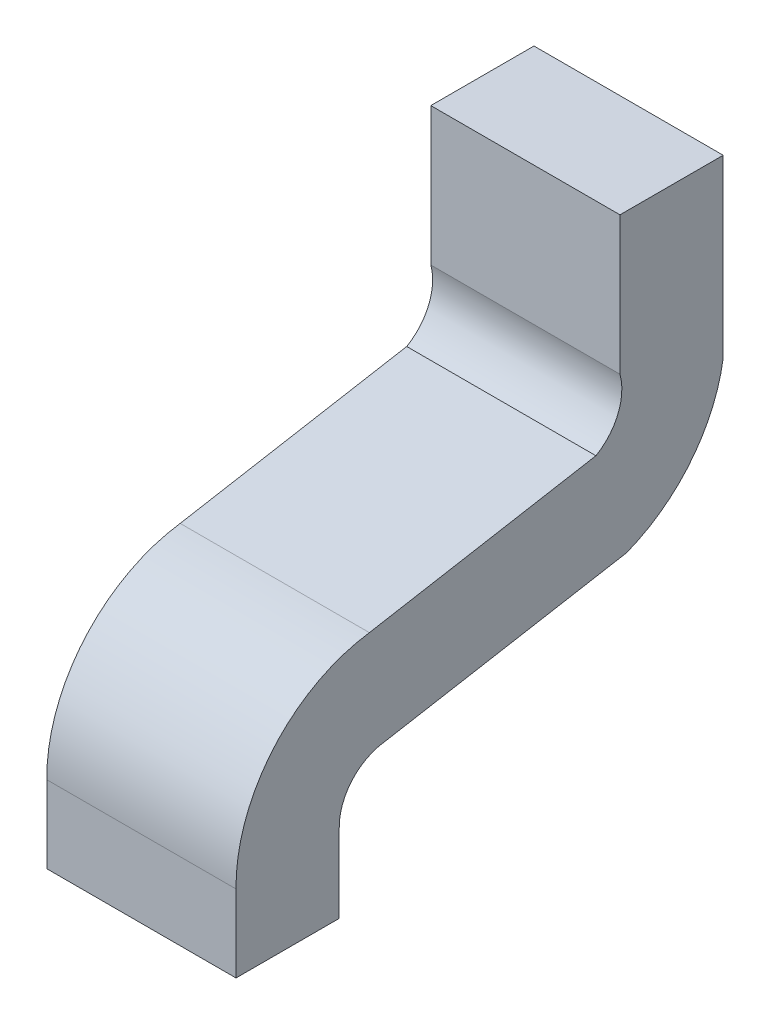
ISO-10303-21;
HEADER;
FILE_DESCRIPTION(('STEP AP214'),'2;1');
FILE_NAME('part.step','',(''),(''),'','','');
FILE_SCHEMA(('AUTOMOTIVE_DESIGN { 1 0 10303 214 1 1 1 1 }'));
ENDSEC;
DATA;
#1=APPLICATION_CONTEXT('core data for automotive mechanical design processes');
#2=APPLICATION_PROTOCOL_DEFINITION('international standard','automotive_design',2000,#1);
#3=PRODUCT_CONTEXT('',#1,'mechanical');
#4=PRODUCT('Part','Part','',(#3));
#5=PRODUCT_RELATED_PRODUCT_CATEGORY('part','',(#4));
#6=PRODUCT_DEFINITION_FORMATION('','',#4);
#7=PRODUCT_DEFINITION_CONTEXT('part definition',#1,'design');
#8=PRODUCT_DEFINITION('design','',#6,#7);
#9=PRODUCT_DEFINITION_SHAPE('','',#8);
#10=(LENGTH_UNIT() NAMED_UNIT(*) SI_UNIT(.MILLI.,.METRE.));
#11=(NAMED_UNIT(*) PLANE_ANGLE_UNIT() SI_UNIT($,.RADIAN.));
#12=(NAMED_UNIT(*) SI_UNIT($,.STERADIAN.) SOLID_ANGLE_UNIT());
#13=UNCERTAINTY_MEASURE_WITH_UNIT(LENGTH_MEASURE(1.E-05),#10,'distance_accuracy_value','');
#14=(GEOMETRIC_REPRESENTATION_CONTEXT(3) GLOBAL_UNCERTAINTY_ASSIGNED_CONTEXT((#13)) GLOBAL_UNIT_ASSIGNED_CONTEXT((#10,
#11,#12)) REPRESENTATION_CONTEXT('',''));
#15=CARTESIAN_POINT('',(0.,0.,0.));
#16=DIRECTION('',(0.,0.,1.));
#17=DIRECTION('',(1.,0.,0.));
#18=AXIS2_PLACEMENT_3D('',#15,#16,#17);
#19=CARTESIAN_POINT('',(0.22,0.566981111233,-0.255632636838));
#20=DIRECTION('',(1.,0.,0.));
#21=DIRECTION('',(0.,-1.,0.));
#22=AXIS2_PLACEMENT_3D('',#19,#20,#21);
#23=PLANE('',#22);
#24=DIRECTION('',(0.,0.,-1.));
#25=VECTOR('',#24,1.);
#26=CARTESIAN_POINT('',(0.22,0.307386061785,0.04787499999997));
#27=LINE('',#26,#25);
#28=CARTESIAN_POINT('',(0.22,0.307386061785,0.04787499999998));
#29=VERTEX_POINT('',#28);
#30=CARTESIAN_POINT('',(0.22,0.307386061785,-0.07212500000003));
#31=VERTEX_POINT('',#30);
#32=EDGE_CURVE('E158',#29,#31,#27,.T.);
#33=ORIENTED_EDGE('',*,*,#32,.T.);
#34=DIRECTION('',(0.,1.,0.));
#35=VECTOR('',#34,1.);
#36=CARTESIAN_POINT('',(0.22,0.307386061785,-0.07212500000003));
#37=LINE('',#36,#35);
#38=CARTESIAN_POINT('',(0.22,0.398034,-0.07212500000003));
#39=VERTEX_POINT('',#38);
#40=EDGE_CURVE('E11',#31,#39,#37,.T.);
#41=ORIENTED_EDGE('',*,*,#40,.T.);
#42=CARTESIAN_POINT('',(0.22,0.399385348479,-0.132109780214));
#43=DIRECTION('',(1.,0.,0.));
#44=DIRECTION('',(0.,1.,0.));
#45=AXIS2_PLACEMENT_3D('',#42,#43,#44);
#46=CIRCLE('',#45,0.06);
#47=CARTESIAN_POINT('',(0.22,0.459004806819,-0.125362915222));
#48=VERTEX_POINT('',#47);
#49=EDGE_CURVE('E261',#48,#39,#46,.T.);
#50=ORIENTED_EDGE('',*,*,#49,.F.);
#51=DIRECTION('',(0.,0.173648177667033,-0.98480775301219));
#52=VECTOR('',#51,1.);
#53=CARTESIAN_POINT('',(0.22,0.459004806819,-0.125362915222));
#54=LINE('',#53,#52);
#55=CARTESIAN_POINT('',(0.22,0.508567174855,-0.406445072001));
#56=VERTEX_POINT('',#55);
#57=EDGE_CURVE('E258',#48,#56,#54,.T.);
#58=ORIENTED_EDGE('',*,*,#57,.T.);
#59=CARTESIAN_POINT('',(0.22,0.676168403342,-0.340795790133));
#60=DIRECTION('',(1.,0.,0.));
#61=DIRECTION('',(0.,1.,0.));
#62=AXIS2_PLACEMENT_3D('',#59,#60,#61);
#63=CIRCLE('',#62,0.18);
#64=CARTESIAN_POINT('',(0.22,0.648175256066,-0.51860575528));
#65=VERTEX_POINT('',#64);
#66=EDGE_CURVE('E167',#56,#65,#63,.T.);
#67=ORIENTED_EDGE('',*,*,#66,.T.);
#68=DIRECTION('',(0.,-1.,0.));
#69=VECTOR('',#68,1.);
#70=CARTESIAN_POINT('',(0.22,0.852705061636,-0.51860575528));
#71=LINE('',#70,#69);
#72=CARTESIAN_POINT('',(0.22,0.852705061636,-0.51860575528));
#73=VERTEX_POINT('',#72);
#74=EDGE_CURVE('E199',#73,#65,#71,.T.);
#75=ORIENTED_EDGE('',*,*,#74,.F.);
#76=DIRECTION('',(0.,0.,-1.));
#77=VECTOR('',#76,1.);
#78=CARTESIAN_POINT('',(0.22,0.852705061636,-0.39860575528));
#79=LINE('',#78,#77);
#80=CARTESIAN_POINT('',(0.22,0.852705061636,-0.39860575528));
#81=VERTEX_POINT('',#80);
#82=EDGE_CURVE('E228',#81,#73,#79,.T.);
#83=ORIENTED_EDGE('',*,*,#82,.F.);
#84=DIRECTION('',(0.,1.,0.));
#85=VECTOR('',#84,1.);
#86=CARTESIAN_POINT('',(0.22,0.692231028585,-0.39860575528));
#87=LINE('',#86,#85);
#88=CARTESIAN_POINT('',(0.22,0.692231028585,-0.39860575528));
#89=VERTEX_POINT('',#88);
#90=EDGE_CURVE('E185',#89,#81,#87,.T.);
#91=ORIENTED_EDGE('',*,*,#90,.F.);
#92=CARTESIAN_POINT('',(0.22,0.676168403342,-0.340795790133));
#93=DIRECTION('',(1.,0.,0.));
#94=DIRECTION('',(0.,1.,0.));
#95=AXIS2_PLACEMENT_3D('',#92,#93,#94);
#96=CIRCLE('',#95,0.06);
#97=CARTESIAN_POINT('',(0.22,0.62409951054,-0.370609048967));
#98=VERTEX_POINT('',#97);
#99=EDGE_CURVE('E194',#98,#89,#96,.T.);
#100=ORIENTED_EDGE('',*,*,#99,.F.);
#101=DIRECTION('',(0.,0.173648177667033,-0.98480775301219));
#102=VECTOR('',#101,1.);
#103=CARTESIAN_POINT('',(0.22,0.577653507815,-0.107200678123));
#104=LINE('',#103,#102);
#105=CARTESIAN_POINT('',(0.22,0.577653507815,-0.107200678123));
#106=VERTEX_POINT('',#105);
#107=EDGE_CURVE('E198',#106,#98,#104,.T.);
#108=ORIENTED_EDGE('',*,*,#107,.F.);
#109=CARTESIAN_POINT('',(0.22,0.399385348479,-0.132109780214));
#110=DIRECTION('',(1.,0.,0.));
#111=DIRECTION('',(0.,1.,0.));
#112=AXIS2_PLACEMENT_3D('',#109,#110,#111);
#113=CIRCLE('',#112,0.18);
#114=CARTESIAN_POINT('',(0.22,0.39704464529,0.04787499999998));
#115=VERTEX_POINT('',#114);
#116=EDGE_CURVE('E189',#106,#115,#113,.T.);
#117=ORIENTED_EDGE('',*,*,#116,.T.);
#118=DIRECTION('',(0.,1.,0.));
#119=VECTOR('',#118,1.);
#120=CARTESIAN_POINT('',(0.22,0.307386061785,0.04787499999997));
#121=LINE('',#120,#119);
#122=EDGE_CURVE('E172',#29,#115,#121,.T.);
#123=ORIENTED_EDGE('',*,*,#122,.F.);
#124=EDGE_LOOP('',(#33,#41,#50,#58,#67,#75,#83,#91,#100,#108,#117,#123));
#125=FACE_BOUND('',#124,.T.);
#126=ADVANCED_FACE('F17',(#125),#23,.T.);
#127=CARTESIAN_POINT('',(0.,0.566981111233,-0.255632636838));
#128=DIRECTION('',(1.,0.,0.));
#129=DIRECTION('',(0.,-1.,0.));
#130=AXIS2_PLACEMENT_3D('',#127,#128,#129);
#131=PLANE('',#130);
#132=DIRECTION('',(0.,0.,-1.));
#133=VECTOR('',#132,1.);
#134=CARTESIAN_POINT('',(0.,0.307386061785,0.04787499999997));
#135=LINE('',#134,#133);
#136=CARTESIAN_POINT('',(0.,0.307386061785,0.04787499999998));
#137=VERTEX_POINT('',#136);
#138=CARTESIAN_POINT('',(0.,0.307386061785,-0.07212500000003));
#139=VERTEX_POINT('',#138);
#140=EDGE_CURVE('E150',#137,#139,#135,.T.);
#141=ORIENTED_EDGE('',*,*,#140,.F.);
#142=DIRECTION('',(0.,1.,0.));
#143=VECTOR('',#142,1.);
#144=CARTESIAN_POINT('',(0.,0.307386061785,0.04787499999997));
#145=LINE('',#144,#143);
#146=CARTESIAN_POINT('',(0.,0.39704464529,0.04787499999998));
#147=VERTEX_POINT('',#146);
#148=EDGE_CURVE('E136',#137,#147,#145,.T.);
#149=ORIENTED_EDGE('',*,*,#148,.T.);
#150=CARTESIAN_POINT('',(0.,0.399385348479,-0.132109780214));
#151=DIRECTION('',(1.,0.,0.));
#152=DIRECTION('',(0.,1.,0.));
#153=AXIS2_PLACEMENT_3D('',#150,#151,#152);
#154=CIRCLE('',#153,0.18);
#155=CARTESIAN_POINT('',(0.,0.577653507815,-0.107200678123));
#156=VERTEX_POINT('',#155);
#157=EDGE_CURVE('E179',#156,#147,#154,.T.);
#158=ORIENTED_EDGE('',*,*,#157,.F.);
#159=DIRECTION('',(0.,0.173648177667033,-0.98480775301219));
#160=VECTOR('',#159,1.);
#161=CARTESIAN_POINT('',(0.,0.577653507815,-0.107200678123));
#162=LINE('',#161,#160);
#163=CARTESIAN_POINT('',(0.,0.62409951054,-0.370609048967));
#164=VERTEX_POINT('',#163);
#165=EDGE_CURVE('E190',#156,#164,#162,.T.);
#166=ORIENTED_EDGE('',*,*,#165,.T.);
#167=CARTESIAN_POINT('',(0.,0.676168403342,-0.340795790133));
#168=DIRECTION('',(1.,0.,0.));
#169=DIRECTION('',(0.,1.,0.));
#170=AXIS2_PLACEMENT_3D('',#167,#168,#169);
#171=CIRCLE('',#170,0.06);
#172=CARTESIAN_POINT('',(0.,0.692231028585,-0.39860575528));
#173=VERTEX_POINT('',#172);
#174=EDGE_CURVE('E181',#164,#173,#171,.T.);
#175=ORIENTED_EDGE('',*,*,#174,.T.);
#176=DIRECTION('',(0.,1.,0.));
#177=VECTOR('',#176,1.);
#178=CARTESIAN_POINT('',(0.,0.692231028585,-0.39860575528));
#179=LINE('',#178,#177);
#180=CARTESIAN_POINT('',(0.,0.852705061636,-0.39860575528));
#181=VERTEX_POINT('',#180);
#182=EDGE_CURVE('E224',#173,#181,#179,.T.);
#183=ORIENTED_EDGE('',*,*,#182,.T.);
#184=DIRECTION('',(0.,0.,-1.));
#185=VECTOR('',#184,1.);
#186=CARTESIAN_POINT('',(0.,0.852705061636,-0.39860575528));
#187=LINE('',#186,#185);
#188=CARTESIAN_POINT('',(0.,0.852705061636,-0.51860575528));
#189=VERTEX_POINT('',#188);
#190=EDGE_CURVE('E204',#181,#189,#187,.T.);
#191=ORIENTED_EDGE('',*,*,#190,.T.);
#192=DIRECTION('',(0.,-1.,0.));
#193=VECTOR('',#192,1.);
#194=CARTESIAN_POINT('',(0.,0.852705061636,-0.51860575528));
#195=LINE('',#194,#193);
#196=CARTESIAN_POINT('',(0.,0.648175256066,-0.51860575528));
#197=VERTEX_POINT('',#196);
#198=EDGE_CURVE('E242',#189,#197,#195,.T.);
#199=ORIENTED_EDGE('',*,*,#198,.T.);
#200=CARTESIAN_POINT('',(0.,0.676168403342,-0.340795790133));
#201=DIRECTION('',(1.,0.,0.));
#202=DIRECTION('',(0.,1.,0.));
#203=AXIS2_PLACEMENT_3D('',#200,#201,#202);
#204=CIRCLE('',#203,0.18);
#205=CARTESIAN_POINT('',(0.,0.508567174855,-0.406445072001));
#206=VERTEX_POINT('',#205);
#207=EDGE_CURVE('E166',#206,#197,#204,.T.);
#208=ORIENTED_EDGE('',*,*,#207,.F.);
#209=DIRECTION('',(0.,0.173648177667033,-0.98480775301219));
#210=VECTOR('',#209,1.);
#211=CARTESIAN_POINT('',(0.,0.459004806819,-0.125362915222));
#212=LINE('',#211,#210);
#213=CARTESIAN_POINT('',(0.,0.459004806819,-0.125362915222));
#214=VERTEX_POINT('',#213);
#215=EDGE_CURVE('E255',#214,#206,#212,.T.);
#216=ORIENTED_EDGE('',*,*,#215,.F.);
#217=CARTESIAN_POINT('',(0.,0.399385348479,-0.132109780214));
#218=DIRECTION('',(1.,0.,0.));
#219=DIRECTION('',(0.,1.,0.));
#220=AXIS2_PLACEMENT_3D('',#217,#218,#219);
#221=CIRCLE('',#220,0.06);
#222=CARTESIAN_POINT('',(0.,0.398034,-0.07212500000003));
#223=VERTEX_POINT('',#222);
#224=EDGE_CURVE('E267',#214,#223,#221,.T.);
#225=ORIENTED_EDGE('',*,*,#224,.T.);
#226=DIRECTION('',(0.,1.,0.));
#227=VECTOR('',#226,1.);
#228=CARTESIAN_POINT('',(0.,0.307386061785,-0.07212500000003));
#229=LINE('',#228,#227);
#230=EDGE_CURVE('E21',#139,#223,#229,.T.);
#231=ORIENTED_EDGE('',*,*,#230,.F.);
#232=EDGE_LOOP('',(#141,#149,#158,#166,#175,#183,#191,#199,#208,#216,#225,#231));
#233=FACE_BOUND('',#232,.T.);
#234=ADVANCED_FACE('F19',(#233),#131,.F.);
#235=CARTESIAN_POINT('',(0.,0.307386061785,-0.07212500000003));
#236=DIRECTION('',(0.,0.,1.));
#237=DIRECTION('',(0.,-1.,0.));
#238=AXIS2_PLACEMENT_3D('',#235,#236,#237);
#239=PLANE('',#238);
#240=DIRECTION('',(1.,0.,0.));
#241=VECTOR('',#240,1.);
#242=CARTESIAN_POINT('',(0.,0.307386061785,-0.07212500000003));
#243=LINE('',#242,#241);
#244=EDGE_CURVE('E154',#139,#31,#243,.T.);
#245=ORIENTED_EDGE('',*,*,#244,.F.);
#246=ORIENTED_EDGE('',*,*,#230,.T.);
#247=DIRECTION('',(1.,0.,0.));
#248=VECTOR('',#247,1.);
#249=CARTESIAN_POINT('',(0.,0.398034,-0.07212500000003));
#250=LINE('',#249,#248);
#251=EDGE_CURVE('E265',#223,#39,#250,.T.);
#252=ORIENTED_EDGE('',*,*,#251,.T.);
#253=ORIENTED_EDGE('',*,*,#40,.F.);
#254=EDGE_LOOP('',(#245,#246,#252,#253));
#255=FACE_BOUND('',#254,.T.);
#256=ADVANCED_FACE('F308',(#255),#239,.F.);
#257=CARTESIAN_POINT('',(0.,0.399385348479,-0.132109780214));
#258=DIRECTION('',(-1.,0.,0.));
#259=DIRECTION('',(0.,1.,0.));
#260=AXIS2_PLACEMENT_3D('',#257,#258,#259);
#261=CYLINDRICAL_SURFACE('',#260,0.06);
#262=DIRECTION('',(1.,0.,0.));
#263=VECTOR('',#262,1.);
#264=CARTESIAN_POINT('',(0.,0.459004806819,-0.125362915222));
#265=LINE('',#264,#263);
#266=EDGE_CURVE('E251',#214,#48,#265,.T.);
#267=ORIENTED_EDGE('',*,*,#266,.T.);
#268=ORIENTED_EDGE('',*,*,#49,.T.);
#269=ORIENTED_EDGE('',*,*,#251,.F.);
#270=ORIENTED_EDGE('',*,*,#224,.F.);
#271=EDGE_LOOP('',(#267,#268,#269,#270));
#272=FACE_BOUND('',#271,.T.);
#273=ADVANCED_FACE('F302',(#272),#261,.F.);
#274=CARTESIAN_POINT('',(0.,0.459004806819,-0.125362915222));
#275=DIRECTION('',(0.,0.98480775301219,0.173648177667033));
#276=DIRECTION('',(1.,0.,0.));
#277=AXIS2_PLACEMENT_3D('',#274,#275,#276);
#278=PLANE('',#277);
#279=ORIENTED_EDGE('',*,*,#266,.F.);
#280=ORIENTED_EDGE('',*,*,#215,.T.);
#281=DIRECTION('',(1.,0.,0.));
#282=VECTOR('',#281,1.);
#283=CARTESIAN_POINT('',(0.,0.508567174855,-0.406445072001));
#284=LINE('',#283,#282);
#285=EDGE_CURVE('E168',#206,#56,#284,.T.);
#286=ORIENTED_EDGE('',*,*,#285,.T.);
#287=ORIENTED_EDGE('',*,*,#57,.F.);
#288=EDGE_LOOP('',(#279,#280,#286,#287));
#289=FACE_BOUND('',#288,.T.);
#290=ADVANCED_FACE('F307',(#289),#278,.F.);
#291=CARTESIAN_POINT('',(0.,0.676168403342,-0.340795790133));
#292=DIRECTION('',(-1.,0.,0.));
#293=DIRECTION('',(0.,1.,0.));
#294=AXIS2_PLACEMENT_3D('',#291,#292,#293);
#295=CYLINDRICAL_SURFACE('',#294,0.18);
#296=ORIENTED_EDGE('',*,*,#285,.F.);
#297=ORIENTED_EDGE('',*,*,#207,.T.);
#298=DIRECTION('',(1.,0.,0.));
#299=VECTOR('',#298,1.);
#300=CARTESIAN_POINT('',(0.,0.648175256066,-0.51860575528));
#301=LINE('',#300,#299);
#302=EDGE_CURVE('E203',#197,#65,#301,.T.);
#303=ORIENTED_EDGE('',*,*,#302,.T.);
#304=ORIENTED_EDGE('',*,*,#66,.F.);
#305=EDGE_LOOP('',(#296,#297,#303,#304));
#306=FACE_BOUND('',#305,.T.);
#307=ADVANCED_FACE('F363',(#306),#295,.T.);
#308=CARTESIAN_POINT('',(0.,0.852705061636,-0.51860575528));
#309=DIRECTION('',(0.,0.,-1.));
#310=DIRECTION('',(0.,-1.,0.));
#311=AXIS2_PLACEMENT_3D('',#308,#309,#310);
#312=PLANE('',#311);
#313=DIRECTION('',(1.,0.,0.));
#314=VECTOR('',#313,1.);
#315=CARTESIAN_POINT('',(0.,0.852705061636,-0.51860575528));
#316=LINE('',#315,#314);
#317=EDGE_CURVE('E232',#189,#73,#316,.T.);
#318=ORIENTED_EDGE('',*,*,#317,.T.);
#319=ORIENTED_EDGE('',*,*,#74,.T.);
#320=ORIENTED_EDGE('',*,*,#302,.F.);
#321=ORIENTED_EDGE('',*,*,#198,.F.);
#322=EDGE_LOOP('',(#318,#319,#320,#321));
#323=FACE_BOUND('',#322,.T.);
#324=ADVANCED_FACE('F354',(#323),#312,.T.);
#325=CARTESIAN_POINT('',(0.,0.852705061636,-0.39860575528));
#326=DIRECTION('',(0.,1.,0.));
#327=DIRECTION('',(1.,0.,0.));
#328=AXIS2_PLACEMENT_3D('',#325,#326,#327);
#329=PLANE('',#328);
#330=DIRECTION('',(1.,0.,0.));
#331=VECTOR('',#330,1.);
#332=CARTESIAN_POINT('',(0.,0.852705061636,-0.39860575528));
#333=LINE('',#332,#331);
#334=EDGE_CURVE('E220',#181,#81,#333,.T.);
#335=ORIENTED_EDGE('',*,*,#334,.T.);
#336=ORIENTED_EDGE('',*,*,#82,.T.);
#337=ORIENTED_EDGE('',*,*,#317,.F.);
#338=ORIENTED_EDGE('',*,*,#190,.F.);
#339=EDGE_LOOP('',(#335,#336,#337,#338));
#340=FACE_BOUND('',#339,.T.);
#341=ADVANCED_FACE('F338',(#340),#329,.T.);
#342=CARTESIAN_POINT('',(0.,0.692231028585,-0.39860575528));
#343=DIRECTION('',(0.,0.,1.));
#344=DIRECTION('',(0.,-1.,0.));
#345=AXIS2_PLACEMENT_3D('',#342,#343,#344);
#346=PLANE('',#345);
#347=DIRECTION('',(1.,0.,0.));
#348=VECTOR('',#347,1.);
#349=CARTESIAN_POINT('',(0.,0.692231028585,-0.39860575528));
#350=LINE('',#349,#348);
#351=EDGE_CURVE('E186',#173,#89,#350,.T.);
#352=ORIENTED_EDGE('',*,*,#351,.T.);
#353=ORIENTED_EDGE('',*,*,#90,.T.);
#354=ORIENTED_EDGE('',*,*,#334,.F.);
#355=ORIENTED_EDGE('',*,*,#182,.F.);
#356=EDGE_LOOP('',(#352,#353,#354,#355));
#357=FACE_BOUND('',#356,.T.);
#358=ADVANCED_FACE('F333',(#357),#346,.T.);
#359=CARTESIAN_POINT('',(0.,0.676168403342,-0.340795790133));
#360=DIRECTION('',(-1.,0.,0.));
#361=DIRECTION('',(0.,1.,0.));
#362=AXIS2_PLACEMENT_3D('',#359,#360,#361);
#363=CYLINDRICAL_SURFACE('',#362,0.06);
#364=DIRECTION('',(1.,0.,0.));
#365=VECTOR('',#364,1.);
#366=CARTESIAN_POINT('',(0.,0.62409951054,-0.370609048967));
#367=LINE('',#366,#365);
#368=EDGE_CURVE('E195',#164,#98,#367,.T.);
#369=ORIENTED_EDGE('',*,*,#368,.T.);
#370=ORIENTED_EDGE('',*,*,#99,.T.);
#371=ORIENTED_EDGE('',*,*,#351,.F.);
#372=ORIENTED_EDGE('',*,*,#174,.F.);
#373=EDGE_LOOP('',(#369,#370,#371,#372));
#374=FACE_BOUND('',#373,.T.);
#375=ADVANCED_FACE('F320',(#374),#363,.F.);
#376=CARTESIAN_POINT('',(0.,0.577653507815,-0.107200678123));
#377=DIRECTION('',(0.,0.98480775301219,0.173648177667033));
#378=DIRECTION('',(1.,0.,0.));
#379=AXIS2_PLACEMENT_3D('',#376,#377,#378);
#380=PLANE('',#379);
#381=DIRECTION('',(1.,0.,0.));
#382=VECTOR('',#381,1.);
#383=CARTESIAN_POINT('',(0.,0.577653507815,-0.107200678123));
#384=LINE('',#383,#382);
#385=EDGE_CURVE('E147',#156,#106,#384,.T.);
#386=ORIENTED_EDGE('',*,*,#385,.T.);
#387=ORIENTED_EDGE('',*,*,#107,.T.);
#388=ORIENTED_EDGE('',*,*,#368,.F.);
#389=ORIENTED_EDGE('',*,*,#165,.F.);
#390=EDGE_LOOP('',(#386,#387,#388,#389));
#391=FACE_BOUND('',#390,.T.);
#392=ADVANCED_FACE('F315',(#391),#380,.T.);
#393=CARTESIAN_POINT('',(0.,0.399385348479,-0.132109780214));
#394=DIRECTION('',(-1.,0.,0.));
#395=DIRECTION('',(0.,1.,0.));
#396=AXIS2_PLACEMENT_3D('',#393,#394,#395);
#397=CYLINDRICAL_SURFACE('',#396,0.18);
#398=ORIENTED_EDGE('',*,*,#385,.F.);
#399=ORIENTED_EDGE('',*,*,#157,.T.);
#400=DIRECTION('',(1.,0.,0.));
#401=VECTOR('',#400,1.);
#402=CARTESIAN_POINT('',(0.,0.39704464529,0.04787499999997));
#403=LINE('',#402,#401);
#404=EDGE_CURVE('E143',#147,#115,#403,.T.);
#405=ORIENTED_EDGE('',*,*,#404,.T.);
#406=ORIENTED_EDGE('',*,*,#116,.F.);
#407=EDGE_LOOP('',(#398,#399,#405,#406));
#408=FACE_BOUND('',#407,.T.);
#409=ADVANCED_FACE('F297',(#408),#397,.T.);
#410=CARTESIAN_POINT('',(0.,0.307386061785,0.04787499999997));
#411=DIRECTION('',(0.,0.,1.));
#412=DIRECTION('',(0.,-1.,0.));
#413=AXIS2_PLACEMENT_3D('',#410,#411,#412);
#414=PLANE('',#413);
#415=DIRECTION('',(1.,0.,0.));
#416=VECTOR('',#415,1.);
#417=CARTESIAN_POINT('',(0.,0.307386061785,0.04787499999997));
#418=LINE('',#417,#416);
#419=EDGE_CURVE('E141',#137,#29,#418,.T.);
#420=ORIENTED_EDGE('',*,*,#419,.T.);
#421=ORIENTED_EDGE('',*,*,#122,.T.);
#422=ORIENTED_EDGE('',*,*,#404,.F.);
#423=ORIENTED_EDGE('',*,*,#148,.F.);
#424=EDGE_LOOP('',(#420,#421,#422,#423));
#425=FACE_BOUND('',#424,.T.);
#426=ADVANCED_FACE('F138',(#425),#414,.T.);
#427=CARTESIAN_POINT('',(0.,0.307386061785,0.04787499999997));
#428=DIRECTION('',(0.,1.,0.));
#429=DIRECTION('',(1.,0.,0.));
#430=AXIS2_PLACEMENT_3D('',#427,#428,#429);
#431=PLANE('',#430);
#432=ORIENTED_EDGE('',*,*,#419,.F.);
#433=ORIENTED_EDGE('',*,*,#140,.T.);
#434=ORIENTED_EDGE('',*,*,#244,.T.);
#435=ORIENTED_EDGE('',*,*,#32,.F.);
#436=EDGE_LOOP('',(#432,#433,#434,#435));
#437=FACE_BOUND('',#436,.T.);
#438=ADVANCED_FACE('F157',(#437),#431,.F.);
#439=CLOSED_SHELL('',(#126,#234,#256,#273,#290,#307,#324,#341,#358,#375,#392,#409,#426,#438));
#440=MANIFOLD_SOLID_BREP('B1',#439);
#441=ADVANCED_BREP_SHAPE_REPRESENTATION('',(#18,#440),#14);
#442=SHAPE_DEFINITION_REPRESENTATION(#9,#441);
ENDSEC;
END-ISO-10303-21;
